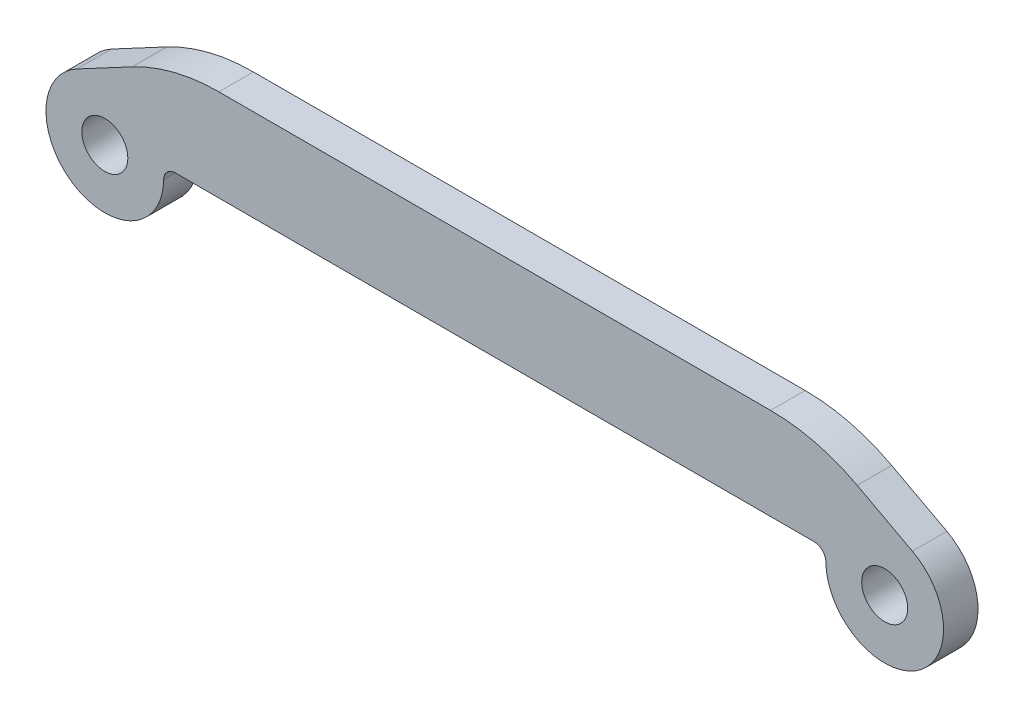
ISO-10303-21;
HEADER;
FILE_DESCRIPTION(('STEP AP214'),'2;1');
FILE_NAME('part.step','',(''),(''),'','','');
FILE_SCHEMA(('AUTOMOTIVE_DESIGN { 1 0 10303 214 1 1 1 1 }'));
ENDSEC;
DATA;
#1=APPLICATION_CONTEXT('core data for automotive mechanical design processes');
#2=APPLICATION_PROTOCOL_DEFINITION('international standard','automotive_design',2000,#1);
#3=PRODUCT_CONTEXT('',#1,'mechanical');
#4=PRODUCT('Part','Part','',(#3));
#5=PRODUCT_RELATED_PRODUCT_CATEGORY('part','',(#4));
#6=PRODUCT_DEFINITION_FORMATION('','',#4);
#7=PRODUCT_DEFINITION_CONTEXT('part definition',#1,'design');
#8=PRODUCT_DEFINITION('design','',#6,#7);
#9=PRODUCT_DEFINITION_SHAPE('','',#8);
#10=(LENGTH_UNIT() NAMED_UNIT(*) SI_UNIT(.MILLI.,.METRE.));
#11=(NAMED_UNIT(*) PLANE_ANGLE_UNIT() SI_UNIT($,.RADIAN.));
#12=(NAMED_UNIT(*) SI_UNIT($,.STERADIAN.) SOLID_ANGLE_UNIT());
#13=UNCERTAINTY_MEASURE_WITH_UNIT(LENGTH_MEASURE(1.E-05),#10,'distance_accuracy_value','');
#14=(GEOMETRIC_REPRESENTATION_CONTEXT(3) GLOBAL_UNCERTAINTY_ASSIGNED_CONTEXT((#13)) GLOBAL_UNIT_ASSIGNED_CONTEXT((#10,
#11,#12)) REPRESENTATION_CONTEXT('',''));
#15=CARTESIAN_POINT('',(0.,0.,0.));
#16=DIRECTION('',(0.,0.,1.));
#17=DIRECTION('',(1.,0.,0.));
#18=AXIS2_PLACEMENT_3D('',#15,#16,#17);
#19=CARTESIAN_POINT('',(1.06,-0.28,0.046875));
#20=DIRECTION('',(0.,0.,1.));
#21=DIRECTION('',(1.,0.,0.));
#22=AXIS2_PLACEMENT_3D('',#19,#20,#21);
#23=PLANE('',#22);
#24=CARTESIAN_POINT('',(-1.06,-0.28,0.046875));
#25=DIRECTION('',(0.,0.,1.));
#26=DIRECTION('',(1.,0.,0.));
#27=AXIS2_PLACEMENT_3D('',#24,#25,#26);
#28=CIRCLE('',#27,0.0625000000000001);
#29=CARTESIAN_POINT('',(-0.9975,-0.28,0.046875));
#30=VERTEX_POINT('',#29);
#31=EDGE_CURVE('E152',#30,#30,#28,.T.);
#32=ORIENTED_EDGE('',*,*,#31,.F.);
#33=EDGE_LOOP('',(#32));
#34=FACE_BOUND('',#33,.T.);
#35=DIRECTION('',(-0.88235294117647,0.470588235294118,0.));
#36=VECTOR('',#35,1.);
#37=CARTESIAN_POINT('',(0.875,0.,0.046875));
#38=LINE('',#37,#36);
#39=CARTESIAN_POINT('',(1.13529411764706,-0.138823529411765,0.046875));
#40=VERTEX_POINT('',#39);
#41=CARTESIAN_POINT('',(0.985294117647059,-0.0588235294117649,0.046875));
#42=VERTEX_POINT('',#41);
#43=EDGE_CURVE('E163',#40,#42,#38,.T.);
#44=ORIENTED_EDGE('',*,*,#43,.T.);
#45=CARTESIAN_POINT('',(0.75,-0.5,0.046875));
#46=DIRECTION('',(0.,0.,1.));
#47=DIRECTION('',(1.,0.,0.));
#48=AXIS2_PLACEMENT_3D('',#45,#46,#47);
#49=CIRCLE('',#48,0.5);
#50=CARTESIAN_POINT('',(0.75,0.,0.046875));
#51=VERTEX_POINT('',#50);
#52=EDGE_CURVE('E177',#42,#51,#49,.T.);
#53=ORIENTED_EDGE('',*,*,#52,.T.);
#54=DIRECTION('',(-1.,0.,0.));
#55=VECTOR('',#54,1.);
#56=CARTESIAN_POINT('',(0.875,0.,0.046875));
#57=LINE('',#56,#55);
#58=CARTESIAN_POINT('',(-0.749999999999999,0.,0.046875));
#59=VERTEX_POINT('',#58);
#60=EDGE_CURVE('E129',#51,#59,#57,.T.);
#61=ORIENTED_EDGE('',*,*,#60,.T.);
#62=CARTESIAN_POINT('',(-0.75,-0.5,0.046875));
#63=DIRECTION('',(0.,0.,1.));
#64=DIRECTION('',(1.,0.,0.));
#65=AXIS2_PLACEMENT_3D('',#62,#63,#64);
#66=CIRCLE('',#65,0.5);
#67=CARTESIAN_POINT('',(-0.985294117647059,-0.0588235294117649,0.046875));
#68=VERTEX_POINT('',#67);
#69=EDGE_CURVE('E125',#59,#68,#66,.T.);
#70=ORIENTED_EDGE('',*,*,#69,.T.);
#71=DIRECTION('',(-0.882352941176471,-0.470588235294118,0.));
#72=VECTOR('',#71,1.);
#73=CARTESIAN_POINT('',(-0.875,0.,0.046875));
#74=LINE('',#73,#72);
#75=CARTESIAN_POINT('',(-1.13529411764706,-0.138823529411765,0.046875));
#76=VERTEX_POINT('',#75);
#77=EDGE_CURVE('E117',#68,#76,#74,.T.);
#78=ORIENTED_EDGE('',*,*,#77,.T.);
#79=CARTESIAN_POINT('',(-1.06,-0.28,0.046875));
#80=DIRECTION('',(0.,0.,1.));
#81=DIRECTION('',(-1.,0.,0.));
#82=AXIS2_PLACEMENT_3D('',#79,#80,#81);
#83=CIRCLE('',#82,0.16);
#84=CARTESIAN_POINT('',(-0.900008680791043,-0.281666666666667,0.046875));
#85=VERTEX_POINT('',#84);
#86=EDGE_CURVE('E121',#76,#85,#83,.T.);
#87=ORIENTED_EDGE('',*,*,#86,.T.);
#88=CARTESIAN_POINT('',(-0.868010416949252,-0.282,0.046875));
#89=DIRECTION('',(0.,0.,1.));
#90=DIRECTION('',(1.,0.,0.));
#91=AXIS2_PLACEMENT_3D('',#88,#89,#90);
#92=CIRCLE('',#91,0.032);
#93=CARTESIAN_POINT('',(-0.868010416949252,-0.25,0.046875));
#94=VERTEX_POINT('',#93);
#95=EDGE_CURVE('E11',#85,#94,#92,.F.);
#96=ORIENTED_EDGE('',*,*,#95,.T.);
#97=DIRECTION('',(1.,0.,0.));
#98=VECTOR('',#97,1.);
#99=CARTESIAN_POINT('',(-0.9,-0.25,0.046875));
#100=LINE('',#99,#98);
#101=CARTESIAN_POINT('',(0.868010416949252,-0.25,0.046875));
#102=VERTEX_POINT('',#101);
#103=EDGE_CURVE('E140',#94,#102,#100,.T.);
#104=ORIENTED_EDGE('',*,*,#103,.T.);
#105=CARTESIAN_POINT('',(0.868010416949252,-0.282,0.046875));
#106=DIRECTION('',(0.,0.,1.));
#107=DIRECTION('',(1.,0.,0.));
#108=AXIS2_PLACEMENT_3D('',#105,#106,#107);
#109=CIRCLE('',#108,0.032);
#110=CARTESIAN_POINT('',(0.900008680791043,-0.281666666666667,0.046875));
#111=VERTEX_POINT('',#110);
#112=EDGE_CURVE('E192',#102,#111,#109,.F.);
#113=ORIENTED_EDGE('',*,*,#112,.T.);
#114=CARTESIAN_POINT('',(1.06,-0.28,0.046875));
#115=DIRECTION('',(0.,0.,1.));
#116=DIRECTION('',(1.,0.,0.));
#117=AXIS2_PLACEMENT_3D('',#114,#115,#116);
#118=CIRCLE('',#117,0.16);
#119=EDGE_CURVE('E143',#111,#40,#118,.T.);
#120=ORIENTED_EDGE('',*,*,#119,.T.);
#121=EDGE_LOOP('',(#44,#53,#61,#70,#78,#87,#96,#104,#113,#120));
#122=FACE_BOUND('',#121,.T.);
#123=CARTESIAN_POINT('',(1.06,-0.28,0.046875));
#124=DIRECTION('',(0.,0.,1.));
#125=DIRECTION('',(-1.,0.,0.));
#126=AXIS2_PLACEMENT_3D('',#123,#124,#125);
#127=CIRCLE('',#126,0.0625000000000001);
#128=CARTESIAN_POINT('',(0.9975,-0.28,0.046875));
#129=VERTEX_POINT('',#128);
#130=EDGE_CURVE('E265',#129,#129,#127,.T.);
#131=ORIENTED_EDGE('',*,*,#130,.F.);
#132=EDGE_LOOP('',(#131));
#133=FACE_BOUND('',#132,.T.);
#134=ADVANCED_FACE('F41',(#34,#122,#133),#23,.T.);
#135=CARTESIAN_POINT('',(1.06,-0.28,-0.046875));
#136=DIRECTION('',(0.,0.,1.));
#137=DIRECTION('',(1.,0.,0.));
#138=AXIS2_PLACEMENT_3D('',#135,#136,#137);
#139=PLANE('',#138);
#140=DIRECTION('',(-1.,0.,0.));
#141=VECTOR('',#140,1.);
#142=CARTESIAN_POINT('',(0.875,0.,-0.046875));
#143=LINE('',#142,#141);
#144=CARTESIAN_POINT('',(0.75,0.,-0.046875));
#145=VERTEX_POINT('',#144);
#146=CARTESIAN_POINT('',(-0.749999999999999,0.,-0.046875));
#147=VERTEX_POINT('',#146);
#148=EDGE_CURVE('E151',#145,#147,#143,.T.);
#149=ORIENTED_EDGE('',*,*,#148,.F.);
#150=CARTESIAN_POINT('',(0.75,-0.5,-0.046875));
#151=DIRECTION('',(0.,0.,1.));
#152=DIRECTION('',(1.,0.,0.));
#153=AXIS2_PLACEMENT_3D('',#150,#151,#152);
#154=CIRCLE('',#153,0.5);
#155=CARTESIAN_POINT('',(0.985294117647059,-0.0588235294117649,-0.046875));
#156=VERTEX_POINT('',#155);
#157=EDGE_CURVE('E172',#145,#156,#154,.F.);
#158=ORIENTED_EDGE('',*,*,#157,.T.);
#159=DIRECTION('',(-0.88235294117647,0.470588235294118,0.));
#160=VECTOR('',#159,1.);
#161=CARTESIAN_POINT('',(0.875,0.,-0.046875));
#162=LINE('',#161,#160);
#163=CARTESIAN_POINT('',(1.13529411764706,-0.138823529411765,-0.046875));
#164=VERTEX_POINT('',#163);
#165=EDGE_CURVE('E148',#164,#156,#162,.T.);
#166=ORIENTED_EDGE('',*,*,#165,.F.);
#167=CARTESIAN_POINT('',(1.06,-0.28,-0.046875));
#168=DIRECTION('',(0.,0.,1.));
#169=DIRECTION('',(1.,0.,0.));
#170=AXIS2_PLACEMENT_3D('',#167,#168,#169);
#171=CIRCLE('',#170,0.16);
#172=CARTESIAN_POINT('',(0.900008680791043,-0.281666666666667,-0.046875));
#173=VERTEX_POINT('',#172);
#174=EDGE_CURVE('E161',#173,#164,#171,.T.);
#175=ORIENTED_EDGE('',*,*,#174,.F.);
#176=CARTESIAN_POINT('',(0.868010416949252,-0.282,-0.046875));
#177=DIRECTION('',(0.,0.,1.));
#178=DIRECTION('',(1.,0.,0.));
#179=AXIS2_PLACEMENT_3D('',#176,#177,#178);
#180=CIRCLE('',#179,0.032);
#181=CARTESIAN_POINT('',(0.868010416949252,-0.25,-0.046875));
#182=VERTEX_POINT('',#181);
#183=EDGE_CURVE('E190',#173,#182,#180,.T.);
#184=ORIENTED_EDGE('',*,*,#183,.T.);
#185=DIRECTION('',(1.,0.,0.));
#186=VECTOR('',#185,1.);
#187=CARTESIAN_POINT('',(-0.9,-0.25,-0.046875));
#188=LINE('',#187,#186);
#189=CARTESIAN_POINT('',(-0.868010416949252,-0.25,-0.046875));
#190=VERTEX_POINT('',#189);
#191=EDGE_CURVE('E158',#190,#182,#188,.T.);
#192=ORIENTED_EDGE('',*,*,#191,.F.);
#193=CARTESIAN_POINT('',(-0.868010416949252,-0.282,-0.046875));
#194=DIRECTION('',(0.,0.,1.));
#195=DIRECTION('',(1.,0.,0.));
#196=AXIS2_PLACEMENT_3D('',#193,#194,#195);
#197=CIRCLE('',#196,0.032);
#198=CARTESIAN_POINT('',(-0.900008680791043,-0.281666666666667,-0.046875));
#199=VERTEX_POINT('',#198);
#200=EDGE_CURVE('E49',#190,#199,#197,.T.);
#201=ORIENTED_EDGE('',*,*,#200,.T.);
#202=CARTESIAN_POINT('',(-1.06,-0.28,-0.046875));
#203=DIRECTION('',(0.,0.,1.));
#204=DIRECTION('',(-1.,0.,0.));
#205=AXIS2_PLACEMENT_3D('',#202,#203,#204);
#206=CIRCLE('',#205,0.16);
#207=CARTESIAN_POINT('',(-1.13529411764706,-0.138823529411765,-0.046875));
#208=VERTEX_POINT('',#207);
#209=EDGE_CURVE('E156',#208,#199,#206,.T.);
#210=ORIENTED_EDGE('',*,*,#209,.F.);
#211=DIRECTION('',(-0.882352941176471,-0.470588235294118,0.));
#212=VECTOR('',#211,1.);
#213=CARTESIAN_POINT('',(-0.875,0.,-0.046875));
#214=LINE('',#213,#212);
#215=CARTESIAN_POINT('',(-0.985294117647059,-0.0588235294117649,-0.046875));
#216=VERTEX_POINT('',#215);
#217=EDGE_CURVE('E135',#216,#208,#214,.T.);
#218=ORIENTED_EDGE('',*,*,#217,.F.);
#219=CARTESIAN_POINT('',(-0.75,-0.5,-0.046875));
#220=DIRECTION('',(0.,0.,1.));
#221=DIRECTION('',(1.,0.,0.));
#222=AXIS2_PLACEMENT_3D('',#219,#220,#221);
#223=CIRCLE('',#222,0.5);
#224=EDGE_CURVE('E170',#216,#147,#223,.F.);
#225=ORIENTED_EDGE('',*,*,#224,.T.);
#226=EDGE_LOOP('',(#149,#158,#166,#175,#184,#192,#201,#210,#218,#225));
#227=FACE_BOUND('',#226,.T.);
#228=CARTESIAN_POINT('',(-1.06,-0.28,-0.046875));
#229=DIRECTION('',(0.,0.,1.));
#230=DIRECTION('',(1.,0.,0.));
#231=AXIS2_PLACEMENT_3D('',#228,#229,#230);
#232=CIRCLE('',#231,0.0625000000000001);
#233=CARTESIAN_POINT('',(-0.9975,-0.28,-0.046875));
#234=VERTEX_POINT('',#233);
#235=EDGE_CURVE('E262',#234,#234,#232,.T.);
#236=ORIENTED_EDGE('',*,*,#235,.T.);
#237=EDGE_LOOP('',(#236));
#238=FACE_BOUND('',#237,.T.);
#239=CARTESIAN_POINT('',(1.06,-0.28,-0.046875));
#240=DIRECTION('',(0.,0.,1.));
#241=DIRECTION('',(-1.,0.,0.));
#242=AXIS2_PLACEMENT_3D('',#239,#240,#241);
#243=CIRCLE('',#242,0.0625000000000001);
#244=CARTESIAN_POINT('',(0.9975,-0.28,-0.046875));
#245=VERTEX_POINT('',#244);
#246=EDGE_CURVE('E268',#245,#245,#243,.T.);
#247=ORIENTED_EDGE('',*,*,#246,.T.);
#248=EDGE_LOOP('',(#247));
#249=FACE_BOUND('',#248,.T.);
#250=ADVANCED_FACE('F206',(#227,#238,#249),#139,.F.);
#251=CARTESIAN_POINT('',(0.875,0.,0.046875));
#252=DIRECTION('',(-0.470588235294119,-0.88235294117647,0.));
#253=DIRECTION('',(0.88235294117647,-0.470588235294119,0.));
#254=AXIS2_PLACEMENT_3D('',#251,#252,#253);
#255=PLANE('',#254);
#256=ORIENTED_EDGE('',*,*,#165,.T.);
#257=DIRECTION('',(0.,0.,-1.));
#258=VECTOR('',#257,1.);
#259=CARTESIAN_POINT('',(0.985294117647059,-0.0588235294117649,0.046875));
#260=LINE('',#259,#258);
#261=EDGE_CURVE('E174',#156,#42,#260,.F.);
#262=ORIENTED_EDGE('',*,*,#261,.T.);
#263=ORIENTED_EDGE('',*,*,#43,.F.);
#264=DIRECTION('',(0.,0.,-1.));
#265=VECTOR('',#264,1.);
#266=CARTESIAN_POINT('',(1.13529411764706,-0.138823529411765,0.046875));
#267=LINE('',#266,#265);
#268=EDGE_CURVE('E137',#40,#164,#267,.T.);
#269=ORIENTED_EDGE('',*,*,#268,.T.);
#270=EDGE_LOOP('',(#256,#262,#263,#269));
#271=FACE_BOUND('',#270,.T.);
#272=ADVANCED_FACE('F224',(#271),#255,.F.);
#273=CARTESIAN_POINT('',(0.875,0.,0.046875));
#274=DIRECTION('',(0.,-1.,0.));
#275=DIRECTION('',(1.,0.,0.));
#276=AXIS2_PLACEMENT_3D('',#273,#274,#275);
#277=PLANE('',#276);
#278=ORIENTED_EDGE('',*,*,#60,.F.);
#279=DIRECTION('',(0.,0.,-1.));
#280=VECTOR('',#279,1.);
#281=CARTESIAN_POINT('',(0.75,0.,0.046875));
#282=LINE('',#281,#280);
#283=EDGE_CURVE('E167',#51,#145,#282,.T.);
#284=ORIENTED_EDGE('',*,*,#283,.T.);
#285=ORIENTED_EDGE('',*,*,#148,.T.);
#286=DIRECTION('',(0.,0.,-1.));
#287=VECTOR('',#286,1.);
#288=CARTESIAN_POINT('',(-0.75,0.,0.046875));
#289=LINE('',#288,#287);
#290=EDGE_CURVE('E136',#147,#59,#289,.F.);
#291=ORIENTED_EDGE('',*,*,#290,.T.);
#292=EDGE_LOOP('',(#278,#284,#285,#291));
#293=FACE_BOUND('',#292,.T.);
#294=ADVANCED_FACE('F239',(#293),#277,.F.);
#295=CARTESIAN_POINT('',(-0.875,0.,0.046875));
#296=DIRECTION('',(0.470588235294118,-0.882352941176471,0.));
#297=DIRECTION('',(0.882352941176471,0.470588235294118,0.));
#298=AXIS2_PLACEMENT_3D('',#295,#296,#297);
#299=PLANE('',#298);
#300=ORIENTED_EDGE('',*,*,#77,.F.);
#301=DIRECTION('',(0.,0.,-1.));
#302=VECTOR('',#301,1.);
#303=CARTESIAN_POINT('',(-0.985294117647059,-0.0588235294117649,0.046875));
#304=LINE('',#303,#302);
#305=EDGE_CURVE('E179',#68,#216,#304,.T.);
#306=ORIENTED_EDGE('',*,*,#305,.T.);
#307=ORIENTED_EDGE('',*,*,#217,.T.);
#308=DIRECTION('',(0.,0.,-1.));
#309=VECTOR('',#308,1.);
#310=CARTESIAN_POINT('',(-1.13529411764706,-0.138823529411765,0.046875));
#311=LINE('',#310,#309);
#312=EDGE_CURVE('E132',#76,#208,#311,.T.);
#313=ORIENTED_EDGE('',*,*,#312,.F.);
#314=EDGE_LOOP('',(#300,#306,#307,#313));
#315=FACE_BOUND('',#314,.T.);
#316=ADVANCED_FACE('F133',(#315),#299,.F.);
#317=CARTESIAN_POINT('',(-1.06,-0.28,0.046875));
#318=DIRECTION('',(0.,0.,-1.));
#319=DIRECTION('',(-1.,0.,0.));
#320=AXIS2_PLACEMENT_3D('',#317,#318,#319);
#321=CYLINDRICAL_SURFACE('',#320,0.16);
#322=ORIENTED_EDGE('',*,*,#209,.T.);
#323=DIRECTION('',(0.,0.,-1.));
#324=VECTOR('',#323,1.);
#325=CARTESIAN_POINT('',(-0.900008680791043,-0.281666666666667,0.046875));
#326=LINE('',#325,#324);
#327=EDGE_CURVE('E56',#199,#85,#326,.F.);
#328=ORIENTED_EDGE('',*,*,#327,.T.);
#329=ORIENTED_EDGE('',*,*,#86,.F.);
#330=ORIENTED_EDGE('',*,*,#312,.T.);
#331=EDGE_LOOP('',(#322,#328,#329,#330));
#332=FACE_BOUND('',#331,.T.);
#333=ADVANCED_FACE('F139',(#332),#321,.T.);
#334=CARTESIAN_POINT('',(-0.9,-0.25,0.046875));
#335=DIRECTION('',(0.,1.,0.));
#336=DIRECTION('',(0.,0.,1.));
#337=AXIS2_PLACEMENT_3D('',#334,#335,#336);
#338=PLANE('',#337);
#339=ORIENTED_EDGE('',*,*,#191,.T.);
#340=DIRECTION('',(0.,0.,1.));
#341=VECTOR('',#340,1.);
#342=CARTESIAN_POINT('',(0.868010416949252,-0.25,0.046875));
#343=LINE('',#342,#341);
#344=EDGE_CURVE('E187',#182,#102,#343,.T.);
#345=ORIENTED_EDGE('',*,*,#344,.T.);
#346=ORIENTED_EDGE('',*,*,#103,.F.);
#347=DIRECTION('',(0.,0.,1.));
#348=VECTOR('',#347,1.);
#349=CARTESIAN_POINT('',(-0.868010416949252,-0.25,-0.046875));
#350=LINE('',#349,#348);
#351=EDGE_CURVE('E184',#94,#190,#350,.F.);
#352=ORIENTED_EDGE('',*,*,#351,.T.);
#353=EDGE_LOOP('',(#339,#345,#346,#352));
#354=FACE_BOUND('',#353,.T.);
#355=ADVANCED_FACE('F210',(#354),#338,.F.);
#356=CARTESIAN_POINT('',(1.06,-0.28,0.046875));
#357=DIRECTION('',(0.,0.,-1.));
#358=DIRECTION('',(-1.,0.,0.));
#359=AXIS2_PLACEMENT_3D('',#356,#357,#358);
#360=CYLINDRICAL_SURFACE('',#359,0.16);
#361=ORIENTED_EDGE('',*,*,#119,.F.);
#362=DIRECTION('',(0.,0.,-1.));
#363=VECTOR('',#362,1.);
#364=CARTESIAN_POINT('',(0.900008680791043,-0.281666666666667,0.046875));
#365=LINE('',#364,#363);
#366=EDGE_CURVE('E181',#111,#173,#365,.T.);
#367=ORIENTED_EDGE('',*,*,#366,.T.);
#368=ORIENTED_EDGE('',*,*,#174,.T.);
#369=ORIENTED_EDGE('',*,*,#268,.F.);
#370=EDGE_LOOP('',(#361,#367,#368,#369));
#371=FACE_BOUND('',#370,.T.);
#372=ADVANCED_FACE('F201',(#371),#360,.T.);
#373=CARTESIAN_POINT('',(-1.06,-0.28,0.046875));
#374=DIRECTION('',(0.,0.,-1.));
#375=DIRECTION('',(-1.,0.,0.));
#376=AXIS2_PLACEMENT_3D('',#373,#374,#375);
#377=CYLINDRICAL_SURFACE('',#376,0.0625000000000001);
#378=ORIENTED_EDGE('',*,*,#31,.T.);
#379=EDGE_LOOP('',(#378));
#380=FACE_BOUND('',#379,.T.);
#381=ORIENTED_EDGE('',*,*,#235,.F.);
#382=EDGE_LOOP('',(#381));
#383=FACE_BOUND('',#382,.T.);
#384=ADVANCED_FACE('F228',(#380,#383),#377,.F.);
#385=CARTESIAN_POINT('',(1.06,-0.28,0.046875));
#386=DIRECTION('',(0.,0.,-1.));
#387=DIRECTION('',(-1.,0.,0.));
#388=AXIS2_PLACEMENT_3D('',#385,#386,#387);
#389=CYLINDRICAL_SURFACE('',#388,0.0625000000000001);
#390=ORIENTED_EDGE('',*,*,#130,.T.);
#391=EDGE_LOOP('',(#390));
#392=FACE_BOUND('',#391,.T.);
#393=ORIENTED_EDGE('',*,*,#246,.F.);
#394=EDGE_LOOP('',(#393));
#395=FACE_BOUND('',#394,.T.);
#396=ADVANCED_FACE('F249',(#392,#395),#389,.F.);
#397=CARTESIAN_POINT('',(0.75,-0.5,0.046875));
#398=DIRECTION('',(0.,0.,-1.));
#399=DIRECTION('',(-1.,0.,0.));
#400=AXIS2_PLACEMENT_3D('',#397,#398,#399);
#401=CYLINDRICAL_SURFACE('',#400,0.5);
#402=ORIENTED_EDGE('',*,*,#52,.F.);
#403=ORIENTED_EDGE('',*,*,#261,.F.);
#404=ORIENTED_EDGE('',*,*,#157,.F.);
#405=ORIENTED_EDGE('',*,*,#283,.F.);
#406=EDGE_LOOP('',(#402,#403,#404,#405));
#407=FACE_BOUND('',#406,.T.);
#408=ADVANCED_FACE('F246',(#407),#401,.T.);
#409=CARTESIAN_POINT('',(-0.75,-0.5,0.046875));
#410=DIRECTION('',(0.,0.,-1.));
#411=DIRECTION('',(-1.,0.,0.));
#412=AXIS2_PLACEMENT_3D('',#409,#410,#411);
#413=CYLINDRICAL_SURFACE('',#412,0.5);
#414=ORIENTED_EDGE('',*,*,#69,.F.);
#415=ORIENTED_EDGE('',*,*,#290,.F.);
#416=ORIENTED_EDGE('',*,*,#224,.F.);
#417=ORIENTED_EDGE('',*,*,#305,.F.);
#418=EDGE_LOOP('',(#414,#415,#416,#417));
#419=FACE_BOUND('',#418,.T.);
#420=ADVANCED_FACE('F217',(#419),#413,.T.);
#421=CARTESIAN_POINT('',(0.868010416949252,-0.282,0.046875));
#422=DIRECTION('',(0.,0.,-1.));
#423=DIRECTION('',(-1.,0.,0.));
#424=AXIS2_PLACEMENT_3D('',#421,#422,#423);
#425=CYLINDRICAL_SURFACE('',#424,0.032);
#426=ORIENTED_EDGE('',*,*,#112,.F.);
#427=ORIENTED_EDGE('',*,*,#344,.F.);
#428=ORIENTED_EDGE('',*,*,#183,.F.);
#429=ORIENTED_EDGE('',*,*,#366,.F.);
#430=EDGE_LOOP('',(#426,#427,#428,#429));
#431=FACE_BOUND('',#430,.T.);
#432=ADVANCED_FACE('F204',(#431),#425,.F.);
#433=CARTESIAN_POINT('',(-0.868010416949252,-0.282,0.046875));
#434=DIRECTION('',(0.,0.,-1.));
#435=DIRECTION('',(-1.,0.,0.));
#436=AXIS2_PLACEMENT_3D('',#433,#434,#435);
#437=CYLINDRICAL_SURFACE('',#436,0.032);
#438=ORIENTED_EDGE('',*,*,#95,.F.);
#439=ORIENTED_EDGE('',*,*,#327,.F.);
#440=ORIENTED_EDGE('',*,*,#200,.F.);
#441=ORIENTED_EDGE('',*,*,#351,.F.);
#442=EDGE_LOOP('',(#438,#439,#440,#441));
#443=FACE_BOUND('',#442,.T.);
#444=ADVANCED_FACE('F43',(#443),#437,.F.);
#445=CLOSED_SHELL('',(#134,#250,#272,#294,#316,#333,#355,#372,#384,#396,#408,#420,#432,#444));
#446=MANIFOLD_SOLID_BREP('B2',#445);
#447=ADVANCED_BREP_SHAPE_REPRESENTATION('',(#18,#446),#14);
#448=SHAPE_DEFINITION_REPRESENTATION(#9,#447);
ENDSEC;
END-ISO-10303-21;
